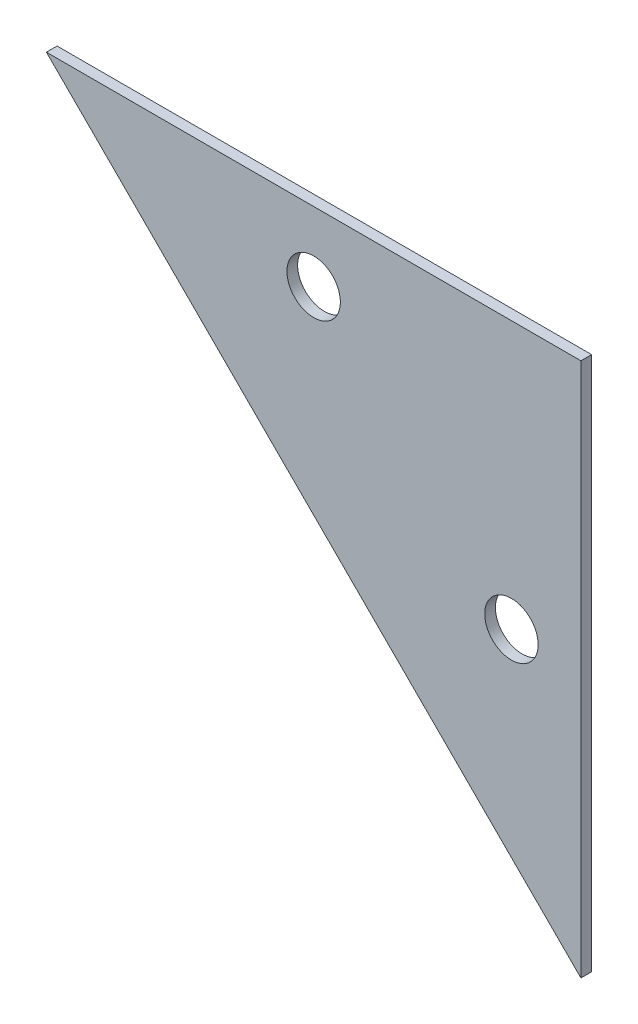
ISO-10303-21;
HEADER;
FILE_DESCRIPTION(('STEP AP214'),'2;1');
FILE_NAME('part.step','',(''),(''),'','','');
FILE_SCHEMA(('AUTOMOTIVE_DESIGN { 1 0 10303 214 1 1 1 1 }'));
ENDSEC;
DATA;
#1=APPLICATION_CONTEXT('core data for automotive mechanical design processes');
#2=APPLICATION_PROTOCOL_DEFINITION('international standard','automotive_design',2000,#1);
#3=PRODUCT_CONTEXT('',#1,'mechanical');
#4=PRODUCT('Part','Part','',(#3));
#5=PRODUCT_RELATED_PRODUCT_CATEGORY('part','',(#4));
#6=PRODUCT_DEFINITION_FORMATION('','',#4);
#7=PRODUCT_DEFINITION_CONTEXT('part definition',#1,'design');
#8=PRODUCT_DEFINITION('design','',#6,#7);
#9=PRODUCT_DEFINITION_SHAPE('','',#8);
#10=(LENGTH_UNIT() NAMED_UNIT(*) SI_UNIT(.MILLI.,.METRE.));
#11=(NAMED_UNIT(*) PLANE_ANGLE_UNIT() SI_UNIT($,.RADIAN.));
#12=(NAMED_UNIT(*) SI_UNIT($,.STERADIAN.) SOLID_ANGLE_UNIT());
#13=UNCERTAINTY_MEASURE_WITH_UNIT(LENGTH_MEASURE(1.E-05),#10,'distance_accuracy_value','');
#14=(GEOMETRIC_REPRESENTATION_CONTEXT(3) GLOBAL_UNCERTAINTY_ASSIGNED_CONTEXT((#13)) GLOBAL_UNIT_ASSIGNED_CONTEXT((#10,
#11,#12)) REPRESENTATION_CONTEXT('',''));
#15=CARTESIAN_POINT('',(0.,0.,0.));
#16=DIRECTION('',(0.,0.,1.));
#17=DIRECTION('',(1.,0.,0.));
#18=AXIS2_PLACEMENT_3D('',#15,#16,#17);
#19=CARTESIAN_POINT('',(0.,0.,2.));
#20=DIRECTION('',(0.,0.,-1.));
#21=DIRECTION('',(-1.,0.,0.));
#22=AXIS2_PLACEMENT_3D('',#19,#20,#21);
#23=PLANE('',#22);
#24=DIRECTION('',(-1.,0.,0.));
#25=VECTOR('',#24,1.);
#26=CARTESIAN_POINT('',(-100.,0.,2.));
#27=LINE('',#26,#25);
#28=CARTESIAN_POINT('',(0.,0.,2.));
#29=VERTEX_POINT('',#28);
#30=CARTESIAN_POINT('',(-100.,0.,2.));
#31=VERTEX_POINT('',#30);
#32=EDGE_CURVE('E75',#29,#31,#27,.T.);
#33=ORIENTED_EDGE('',*,*,#32,.T.);
#34=DIRECTION('',(0.707106781186547,-0.707106781186547,0.));
#35=VECTOR('',#34,1.);
#36=CARTESIAN_POINT('',(0.,-100.,2.));
#37=LINE('',#36,#35);
#38=CARTESIAN_POINT('',(0.,-100.,2.));
#39=VERTEX_POINT('',#38);
#40=EDGE_CURVE('E71',#31,#39,#37,.T.);
#41=ORIENTED_EDGE('',*,*,#40,.T.);
#42=DIRECTION('',(0.,1.,0.));
#43=VECTOR('',#42,1.);
#44=CARTESIAN_POINT('',(0.,0.,2.));
#45=LINE('',#44,#43);
#46=EDGE_CURVE('E51',#39,#29,#45,.T.);
#47=ORIENTED_EDGE('',*,*,#46,.T.);
#48=EDGE_LOOP('',(#33,#41,#47));
#49=FACE_BOUND('',#48,.T.);
#50=CARTESIAN_POINT('',(-50.,-13.,2.));
#51=DIRECTION('',(0.,0.,1.));
#52=DIRECTION('',(1.,0.,0.));
#53=AXIS2_PLACEMENT_3D('',#50,#51,#52);
#54=CIRCLE('',#53,5.);
#55=CARTESIAN_POINT('',(-45.,-13.,2.));
#56=VERTEX_POINT('',#55);
#57=EDGE_CURVE('E85',#56,#56,#54,.T.);
#58=ORIENTED_EDGE('',*,*,#57,.F.);
#59=EDGE_LOOP('',(#58));
#60=FACE_BOUND('',#59,.T.);
#61=CARTESIAN_POINT('',(-13.,-50.,2.));
#62=DIRECTION('',(0.,0.,1.));
#63=DIRECTION('',(1.,0.,0.));
#64=AXIS2_PLACEMENT_3D('',#61,#62,#63);
#65=CIRCLE('',#64,5.);
#66=CARTESIAN_POINT('',(-7.99999999999999,-50.,2.));
#67=VERTEX_POINT('',#66);
#68=EDGE_CURVE('E104',#67,#67,#65,.T.);
#69=ORIENTED_EDGE('',*,*,#68,.F.);
#70=EDGE_LOOP('',(#69));
#71=FACE_BOUND('',#70,.T.);
#72=ADVANCED_FACE('F34',(#49,#60,#71),#23,.F.);
#73=CARTESIAN_POINT('',(0.,0.,0.));
#74=DIRECTION('',(0.,0.,-1.));
#75=DIRECTION('',(-1.,0.,0.));
#76=AXIS2_PLACEMENT_3D('',#73,#74,#75);
#77=PLANE('',#76);
#78=CARTESIAN_POINT('',(-50.,-13.,0.));
#79=DIRECTION('',(0.,0.,1.));
#80=DIRECTION('',(1.,0.,0.));
#81=AXIS2_PLACEMENT_3D('',#78,#79,#80);
#82=CIRCLE('',#81,5.);
#83=CARTESIAN_POINT('',(-45.,-13.,0.));
#84=VERTEX_POINT('',#83);
#85=EDGE_CURVE('E89',#84,#84,#82,.T.);
#86=ORIENTED_EDGE('',*,*,#85,.T.);
#87=EDGE_LOOP('',(#86));
#88=FACE_BOUND('',#87,.T.);
#89=DIRECTION('',(-1.,0.,0.));
#90=VECTOR('',#89,1.);
#91=CARTESIAN_POINT('',(-100.,0.,0.));
#92=LINE('',#91,#90);
#93=CARTESIAN_POINT('',(0.,0.,0.));
#94=VERTEX_POINT('',#93);
#95=CARTESIAN_POINT('',(-100.,0.,0.));
#96=VERTEX_POINT('',#95);
#97=EDGE_CURVE('E82',#94,#96,#92,.T.);
#98=ORIENTED_EDGE('',*,*,#97,.F.);
#99=DIRECTION('',(0.,1.,0.));
#100=VECTOR('',#99,1.);
#101=CARTESIAN_POINT('',(0.,0.,0.));
#102=LINE('',#101,#100);
#103=CARTESIAN_POINT('',(0.,-100.,0.));
#104=VERTEX_POINT('',#103);
#105=EDGE_CURVE('E68',#104,#94,#102,.T.);
#106=ORIENTED_EDGE('',*,*,#105,.F.);
#107=DIRECTION('',(0.707106781186547,-0.707106781186547,0.));
#108=VECTOR('',#107,1.);
#109=CARTESIAN_POINT('',(0.,-100.,0.));
#110=LINE('',#109,#108);
#111=EDGE_CURVE('E63',#96,#104,#110,.T.);
#112=ORIENTED_EDGE('',*,*,#111,.F.);
#113=EDGE_LOOP('',(#98,#106,#112));
#114=FACE_BOUND('',#113,.T.);
#115=CARTESIAN_POINT('',(-13.,-50.,0.));
#116=DIRECTION('',(0.,0.,1.));
#117=DIRECTION('',(1.,0.,0.));
#118=AXIS2_PLACEMENT_3D('',#115,#116,#117);
#119=CIRCLE('',#118,5.);
#120=CARTESIAN_POINT('',(-7.99999999999999,-50.,0.));
#121=VERTEX_POINT('',#120);
#122=EDGE_CURVE('E102',#121,#121,#119,.T.);
#123=ORIENTED_EDGE('',*,*,#122,.T.);
#124=EDGE_LOOP('',(#123));
#125=FACE_BOUND('',#124,.T.);
#126=ADVANCED_FACE('F95',(#88,#114,#125),#77,.T.);
#127=CARTESIAN_POINT('',(-100.,0.,2.));
#128=DIRECTION('',(0.,-1.,0.));
#129=DIRECTION('',(0.,0.,-1.));
#130=AXIS2_PLACEMENT_3D('',#127,#128,#129);
#131=PLANE('',#130);
#132=ORIENTED_EDGE('',*,*,#97,.T.);
#133=DIRECTION('',(0.,0.,-1.));
#134=VECTOR('',#133,1.);
#135=CARTESIAN_POINT('',(-100.,0.,2.));
#136=LINE('',#135,#134);
#137=EDGE_CURVE('E11',#31,#96,#136,.T.);
#138=ORIENTED_EDGE('',*,*,#137,.F.);
#139=ORIENTED_EDGE('',*,*,#32,.F.);
#140=DIRECTION('',(0.,0.,-1.));
#141=VECTOR('',#140,1.);
#142=CARTESIAN_POINT('',(0.,0.,2.));
#143=LINE('',#142,#141);
#144=EDGE_CURVE('E83',#29,#94,#143,.T.);
#145=ORIENTED_EDGE('',*,*,#144,.T.);
#146=EDGE_LOOP('',(#132,#138,#139,#145));
#147=FACE_BOUND('',#146,.T.);
#148=ADVANCED_FACE('F36',(#147),#131,.F.);
#149=CARTESIAN_POINT('',(0.,-100.,2.));
#150=DIRECTION('',(0.707106781186547,0.707106781186547,0.));
#151=DIRECTION('',(-0.707106781186548,0.707106781186548,0.));
#152=AXIS2_PLACEMENT_3D('',#149,#150,#151);
#153=PLANE('',#152);
#154=ORIENTED_EDGE('',*,*,#111,.T.);
#155=DIRECTION('',(0.,0.,-1.));
#156=VECTOR('',#155,1.);
#157=CARTESIAN_POINT('',(0.,-100.,2.));
#158=LINE('',#157,#156);
#159=EDGE_CURVE('E43',#39,#104,#158,.T.);
#160=ORIENTED_EDGE('',*,*,#159,.F.);
#161=ORIENTED_EDGE('',*,*,#40,.F.);
#162=ORIENTED_EDGE('',*,*,#137,.T.);
#163=EDGE_LOOP('',(#154,#160,#161,#162));
#164=FACE_BOUND('',#163,.T.);
#165=ADVANCED_FACE('F72',(#164),#153,.F.);
#166=CARTESIAN_POINT('',(0.,0.,2.));
#167=DIRECTION('',(-1.,0.,0.));
#168=DIRECTION('',(0.,-1.,0.));
#169=AXIS2_PLACEMENT_3D('',#166,#167,#168);
#170=PLANE('',#169);
#171=ORIENTED_EDGE('',*,*,#105,.T.);
#172=ORIENTED_EDGE('',*,*,#144,.F.);
#173=ORIENTED_EDGE('',*,*,#46,.F.);
#174=ORIENTED_EDGE('',*,*,#159,.T.);
#175=EDGE_LOOP('',(#171,#172,#173,#174));
#176=FACE_BOUND('',#175,.T.);
#177=ADVANCED_FACE('F94',(#176),#170,.F.);
#178=CARTESIAN_POINT('',(-50.,-13.,2.));
#179=DIRECTION('',(0.,0.,-1.));
#180=DIRECTION('',(-1.,0.,0.));
#181=AXIS2_PLACEMENT_3D('',#178,#179,#180);
#182=CYLINDRICAL_SURFACE('',#181,5.);
#183=ORIENTED_EDGE('',*,*,#57,.T.);
#184=EDGE_LOOP('',(#183));
#185=FACE_BOUND('',#184,.T.);
#186=ORIENTED_EDGE('',*,*,#85,.F.);
#187=EDGE_LOOP('',(#186));
#188=FACE_BOUND('',#187,.T.);
#189=ADVANCED_FACE('F112',(#185,#188),#182,.F.);
#190=CARTESIAN_POINT('',(-13.,-50.,2.));
#191=DIRECTION('',(0.,0.,-1.));
#192=DIRECTION('',(-1.,0.,0.));
#193=AXIS2_PLACEMENT_3D('',#190,#191,#192);
#194=CYLINDRICAL_SURFACE('',#193,5.);
#195=ORIENTED_EDGE('',*,*,#68,.T.);
#196=EDGE_LOOP('',(#195));
#197=FACE_BOUND('',#196,.T.);
#198=ORIENTED_EDGE('',*,*,#122,.F.);
#199=EDGE_LOOP('',(#198));
#200=FACE_BOUND('',#199,.T.);
#201=ADVANCED_FACE('F114',(#197,#200),#194,.F.);
#202=CLOSED_SHELL('',(#72,#126,#148,#165,#177,#189,#201));
#203=MANIFOLD_SOLID_BREP('B2',#202);
#204=ADVANCED_BREP_SHAPE_REPRESENTATION('',(#18,#203),#14);
#205=SHAPE_DEFINITION_REPRESENTATION(#9,#204);
ENDSEC;
END-ISO-10303-21;
